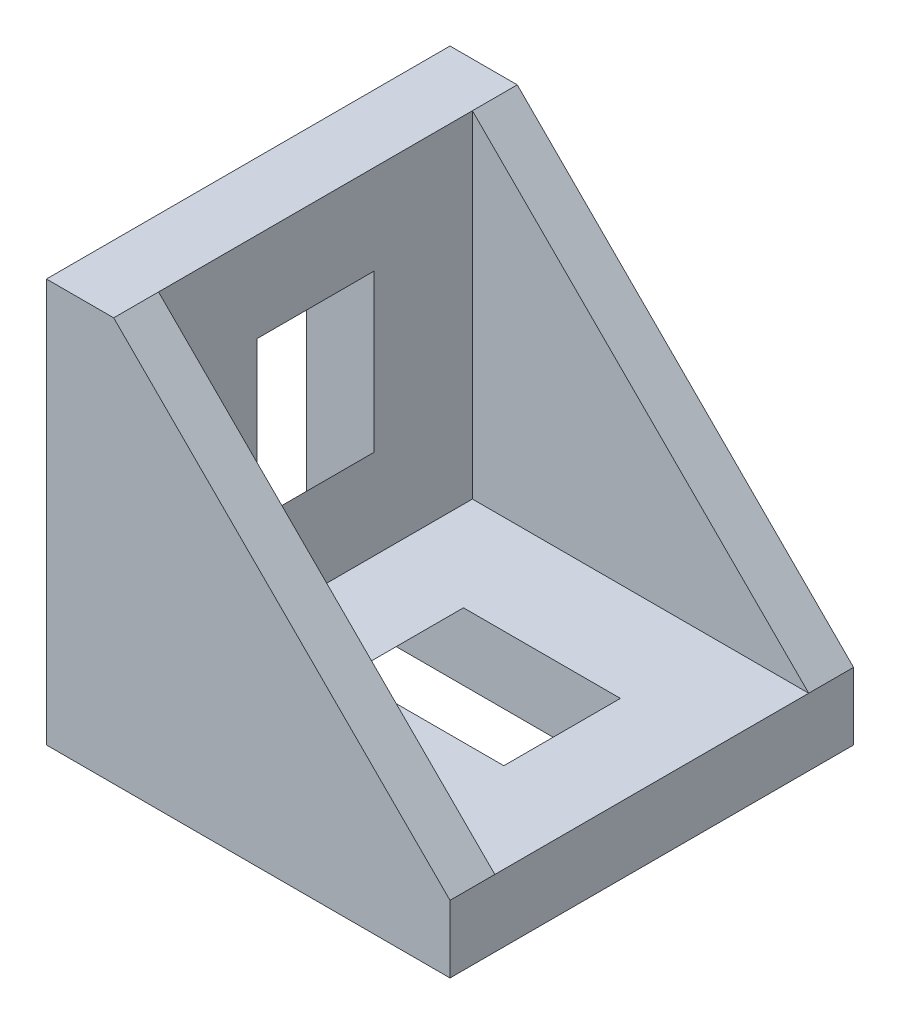
ISO-10303-21;
HEADER;
FILE_DESCRIPTION(('STEP AP214'),'2;1');
FILE_NAME('part.step','',(''),(''),'','','');
FILE_SCHEMA(('AUTOMOTIVE_DESIGN { 1 0 10303 214 1 1 1 1 }'));
ENDSEC;
DATA;
#1=APPLICATION_CONTEXT('core data for automotive mechanical design processes');
#2=APPLICATION_PROTOCOL_DEFINITION('international standard','automotive_design',2000,#1);
#3=PRODUCT_CONTEXT('',#1,'mechanical');
#4=PRODUCT('Part','Part','',(#3));
#5=PRODUCT_RELATED_PRODUCT_CATEGORY('part','',(#4));
#6=PRODUCT_DEFINITION_FORMATION('','',#4);
#7=PRODUCT_DEFINITION_CONTEXT('part definition',#1,'design');
#8=PRODUCT_DEFINITION('design','',#6,#7);
#9=PRODUCT_DEFINITION_SHAPE('','',#8);
#10=(LENGTH_UNIT() NAMED_UNIT(*) SI_UNIT(.MILLI.,.METRE.));
#11=(NAMED_UNIT(*) PLANE_ANGLE_UNIT() SI_UNIT($,.RADIAN.));
#12=(NAMED_UNIT(*) SI_UNIT($,.STERADIAN.) SOLID_ANGLE_UNIT());
#13=UNCERTAINTY_MEASURE_WITH_UNIT(LENGTH_MEASURE(1.E-05),#10,'distance_accuracy_value','');
#14=(GEOMETRIC_REPRESENTATION_CONTEXT(3) GLOBAL_UNCERTAINTY_ASSIGNED_CONTEXT((#13)) GLOBAL_UNIT_ASSIGNED_CONTEXT((#10,
#11,#12)) REPRESENTATION_CONTEXT('',''));
#15=CARTESIAN_POINT('',(0.,0.,0.));
#16=DIRECTION('',(0.,0.,1.));
#17=DIRECTION('',(1.,0.,0.));
#18=AXIS2_PLACEMENT_3D('',#15,#16,#17);
#19=CARTESIAN_POINT('',(0.,0.,9.));
#20=DIRECTION('',(1.,0.,0.));
#21=DIRECTION('',(0.,0.,-1.));
#22=AXIS2_PLACEMENT_3D('',#19,#20,#21);
#23=PLANE('',#22);
#24=DIRECTION('',(0.,0.,-1.));
#25=VECTOR('',#24,1.);
#26=CARTESIAN_POINT('',(0.,17.3,3.));
#27=LINE('',#26,#25);
#28=CARTESIAN_POINT('',(0.,17.3,3.));
#29=VERTEX_POINT('',#28);
#30=CARTESIAN_POINT('',(0.,17.3,-3.));
#31=VERTEX_POINT('',#30);
#32=EDGE_CURVE('E288',#29,#31,#27,.T.);
#33=ORIENTED_EDGE('',*,*,#32,.F.);
#34=DIRECTION('',(0.,1.,0.));
#35=VECTOR('',#34,1.);
#36=CARTESIAN_POINT('',(0.,17.3,3.));
#37=LINE('',#36,#35);
#38=CARTESIAN_POINT('',(0.,14.9992165715514,3.));
#39=VERTEX_POINT('',#38);
#40=EDGE_CURVE('E285',#39,#29,#37,.T.);
#41=ORIENTED_EDGE('',*,*,#40,.F.);
#42=DIRECTION('',(0.,0.,-1.));
#43=VECTOR('',#42,1.);
#44=CARTESIAN_POINT('',(0.,14.9992165715514,3.));
#45=LINE('',#44,#43);
#46=CARTESIAN_POINT('',(0.,14.9992165715514,-3.));
#47=VERTEX_POINT('',#46);
#48=EDGE_CURVE('E299',#39,#47,#45,.T.);
#49=ORIENTED_EDGE('',*,*,#48,.T.);
#50=DIRECTION('',(0.,1.,0.));
#51=VECTOR('',#50,1.);
#52=CARTESIAN_POINT('',(0.,17.3,-3.));
#53=LINE('',#52,#51);
#54=EDGE_CURVE('E280',#47,#31,#53,.T.);
#55=ORIENTED_EDGE('',*,*,#54,.T.);
#56=EDGE_LOOP('',(#33,#41,#49,#55));
#57=FACE_BOUND('',#56,.T.);
#58=DIRECTION('',(0.,-1.,0.));
#59=VECTOR('',#58,1.);
#60=CARTESIAN_POINT('',(0.,14.,-2.6));
#61=LINE('',#60,#59);
#62=CARTESIAN_POINT('',(0.,14.,-2.6));
#63=VERTEX_POINT('',#62);
#64=CARTESIAN_POINT('',(0.,4.,-2.6));
#65=VERTEX_POINT('',#64);
#66=EDGE_CURVE('E402',#63,#65,#61,.T.);
#67=ORIENTED_EDGE('',*,*,#66,.F.);
#68=DIRECTION('',(0.,0.,1.));
#69=VECTOR('',#68,1.);
#70=CARTESIAN_POINT('',(0.,14.,-2.6));
#71=LINE('',#70,#69);
#72=CARTESIAN_POINT('',(0.,14.,2.6));
#73=VERTEX_POINT('',#72);
#74=EDGE_CURVE('E425',#63,#73,#71,.T.);
#75=ORIENTED_EDGE('',*,*,#74,.T.);
#76=DIRECTION('',(0.,-1.,0.));
#77=VECTOR('',#76,1.);
#78=CARTESIAN_POINT('',(0.,14.,2.6));
#79=LINE('',#78,#77);
#80=CARTESIAN_POINT('',(0.,4.,2.6));
#81=VERTEX_POINT('',#80);
#82=EDGE_CURVE('E393',#73,#81,#79,.T.);
#83=ORIENTED_EDGE('',*,*,#82,.T.);
#84=DIRECTION('',(0.,0.,1.));
#85=VECTOR('',#84,1.);
#86=CARTESIAN_POINT('',(0.,4.,-2.6));
#87=LINE('',#86,#85);
#88=EDGE_CURVE('E414',#65,#81,#87,.T.);
#89=ORIENTED_EDGE('',*,*,#88,.F.);
#90=EDGE_LOOP('',(#67,#75,#83,#89));
#91=FACE_BOUND('',#90,.T.);
#92=DIRECTION('',(0.,-1.,0.));
#93=VECTOR('',#92,1.);
#94=CARTESIAN_POINT('',(0.,0.,-9.));
#95=LINE('',#94,#93);
#96=CARTESIAN_POINT('',(0.,18.,-9.));
#97=VERTEX_POINT('',#96);
#98=CARTESIAN_POINT('',(0.,0.,-9.));
#99=VERTEX_POINT('',#98);
#100=EDGE_CURVE('E465',#97,#99,#95,.T.);
#101=ORIENTED_EDGE('',*,*,#100,.T.);
#102=DIRECTION('',(0.,0.,-1.));
#103=VECTOR('',#102,1.);
#104=CARTESIAN_POINT('',(0.,0.,9.));
#105=LINE('',#104,#103);
#106=CARTESIAN_POINT('',(0.,0.,9.));
#107=VERTEX_POINT('',#106);
#108=EDGE_CURVE('E473',#107,#99,#105,.T.);
#109=ORIENTED_EDGE('',*,*,#108,.F.);
#110=DIRECTION('',(0.,-1.,0.));
#111=VECTOR('',#110,1.);
#112=CARTESIAN_POINT('',(0.,0.,9.));
#113=LINE('',#112,#111);
#114=CARTESIAN_POINT('',(0.,18.,9.));
#115=VERTEX_POINT('',#114);
#116=EDGE_CURVE('E471',#115,#107,#113,.T.);
#117=ORIENTED_EDGE('',*,*,#116,.F.);
#118=DIRECTION('',(0.,0.,-1.));
#119=VECTOR('',#118,1.);
#120=CARTESIAN_POINT('',(0.,18.,9.));
#121=LINE('',#120,#119);
#122=EDGE_CURVE('E487',#115,#97,#121,.T.);
#123=ORIENTED_EDGE('',*,*,#122,.T.);
#124=EDGE_LOOP('',(#101,#109,#117,#123));
#125=FACE_BOUND('',#124,.T.);
#126=DIRECTION('',(0.,1.,0.));
#127=VECTOR('',#126,1.);
#128=CARTESIAN_POINT('',(0.,1.23475047748417,3.));
#129=LINE('',#128,#127);
#130=CARTESIAN_POINT('',(0.,1.23475047748417,3.));
#131=VERTEX_POINT('',#130);
#132=CARTESIAN_POINT('',(0.,3.53553390593273,3.));
#133=VERTEX_POINT('',#132);
#134=EDGE_CURVE('E308',#131,#133,#129,.T.);
#135=ORIENTED_EDGE('',*,*,#134,.F.);
#136=DIRECTION('',(0.,0.,-1.));
#137=VECTOR('',#136,1.);
#138=CARTESIAN_POINT('',(0.,1.23475047748417,3.));
#139=LINE('',#138,#137);
#140=CARTESIAN_POINT('',(0.,1.23475047748417,-3.));
#141=VERTEX_POINT('',#140);
#142=EDGE_CURVE('E318',#131,#141,#139,.T.);
#143=ORIENTED_EDGE('',*,*,#142,.T.);
#144=DIRECTION('',(0.,1.,0.));
#145=VECTOR('',#144,1.);
#146=CARTESIAN_POINT('',(0.,1.23475047748417,-3.));
#147=LINE('',#146,#145);
#148=CARTESIAN_POINT('',(0.,3.53553390593273,-3.));
#149=VERTEX_POINT('',#148);
#150=EDGE_CURVE('E307',#141,#149,#147,.T.);
#151=ORIENTED_EDGE('',*,*,#150,.T.);
#152=DIRECTION('',(0.,0.,-1.));
#153=VECTOR('',#152,1.);
#154=CARTESIAN_POINT('',(0.,3.53553390593273,3.));
#155=LINE('',#154,#153);
#156=EDGE_CURVE('E334',#133,#149,#155,.T.);
#157=ORIENTED_EDGE('',*,*,#156,.F.);
#158=EDGE_LOOP('',(#135,#143,#151,#157));
#159=FACE_BOUND('',#158,.T.);
#160=ADVANCED_FACE('F32',(#57,#91,#125,#159),#23,.F.);
#161=CARTESIAN_POINT('',(18.,0.,9.));
#162=DIRECTION('',(0.,1.,0.));
#163=DIRECTION('',(-1.,0.,0.));
#164=AXIS2_PLACEMENT_3D('',#161,#162,#163);
#165=PLANE('',#164);
#166=DIRECTION('',(0.,0.,-1.));
#167=VECTOR('',#166,1.);
#168=CARTESIAN_POINT('',(14.9992165715514,0.,3.));
#169=LINE('',#168,#167);
#170=CARTESIAN_POINT('',(14.9992165715514,0.,3.));
#171=VERTEX_POINT('',#170);
#172=CARTESIAN_POINT('',(14.9992165715514,0.,-3.));
#173=VERTEX_POINT('',#172);
#174=EDGE_CURVE('E47',#171,#173,#169,.T.);
#175=ORIENTED_EDGE('',*,*,#174,.F.);
#176=DIRECTION('',(-1.,0.,0.));
#177=VECTOR('',#176,1.);
#178=CARTESIAN_POINT('',(17.3,0.,3.));
#179=LINE('',#178,#177);
#180=CARTESIAN_POINT('',(17.3,0.,3.));
#181=VERTEX_POINT('',#180);
#182=EDGE_CURVE('E52',#181,#171,#179,.T.);
#183=ORIENTED_EDGE('',*,*,#182,.F.);
#184=DIRECTION('',(0.,0.,-1.));
#185=VECTOR('',#184,1.);
#186=CARTESIAN_POINT('',(17.3,0.,3.));
#187=LINE('',#186,#185);
#188=CARTESIAN_POINT('',(17.3,0.,-3.));
#189=VERTEX_POINT('',#188);
#190=EDGE_CURVE('E260',#181,#189,#187,.T.);
#191=ORIENTED_EDGE('',*,*,#190,.T.);
#192=DIRECTION('',(-1.,0.,0.));
#193=VECTOR('',#192,1.);
#194=CARTESIAN_POINT('',(17.3,0.,-3.));
#195=LINE('',#194,#193);
#196=EDGE_CURVE('E264',#189,#173,#195,.T.);
#197=ORIENTED_EDGE('',*,*,#196,.T.);
#198=EDGE_LOOP('',(#175,#183,#191,#197));
#199=FACE_BOUND('',#198,.T.);
#200=DIRECTION('',(1.,0.,0.));
#201=VECTOR('',#200,1.);
#202=CARTESIAN_POINT('',(4.,0.,-2.6));
#203=LINE('',#202,#201);
#204=CARTESIAN_POINT('',(4.,0.,-2.6));
#205=VERTEX_POINT('',#204);
#206=CARTESIAN_POINT('',(14.,0.,-2.6));
#207=VERTEX_POINT('',#206);
#208=EDGE_CURVE('E370',#205,#207,#203,.T.);
#209=ORIENTED_EDGE('',*,*,#208,.F.);
#210=DIRECTION('',(0.,0.,1.));
#211=VECTOR('',#210,1.);
#212=CARTESIAN_POINT('',(4.,0.,-2.6));
#213=LINE('',#212,#211);
#214=CARTESIAN_POINT('',(4.,0.,2.6));
#215=VERTEX_POINT('',#214);
#216=EDGE_CURVE('E380',#205,#215,#213,.T.);
#217=ORIENTED_EDGE('',*,*,#216,.T.);
#218=DIRECTION('',(1.,0.,0.));
#219=VECTOR('',#218,1.);
#220=CARTESIAN_POINT('',(4.,0.,2.6));
#221=LINE('',#220,#219);
#222=CARTESIAN_POINT('',(14.,0.,2.6));
#223=VERTEX_POINT('',#222);
#224=EDGE_CURVE('E383',#215,#223,#221,.T.);
#225=ORIENTED_EDGE('',*,*,#224,.T.);
#226=DIRECTION('',(0.,0.,1.));
#227=VECTOR('',#226,1.);
#228=CARTESIAN_POINT('',(14.,0.,-2.6));
#229=LINE('',#228,#227);
#230=EDGE_CURVE('E397',#207,#223,#229,.T.);
#231=ORIENTED_EDGE('',*,*,#230,.F.);
#232=EDGE_LOOP('',(#209,#217,#225,#231));
#233=FACE_BOUND('',#232,.T.);
#234=DIRECTION('',(1.,0.,0.));
#235=VECTOR('',#234,1.);
#236=CARTESIAN_POINT('',(18.,0.,-9.));
#237=LINE('',#236,#235);
#238=CARTESIAN_POINT('',(18.,0.,-9.));
#239=VERTEX_POINT('',#238);
#240=EDGE_CURVE('E457',#99,#239,#237,.T.);
#241=ORIENTED_EDGE('',*,*,#240,.T.);
#242=DIRECTION('',(0.,0.,-1.));
#243=VECTOR('',#242,1.);
#244=CARTESIAN_POINT('',(18.,0.,9.));
#245=LINE('',#244,#243);
#246=CARTESIAN_POINT('',(18.,0.,9.));
#247=VERTEX_POINT('',#246);
#248=EDGE_CURVE('E11',#247,#239,#245,.T.);
#249=ORIENTED_EDGE('',*,*,#248,.F.);
#250=DIRECTION('',(1.,0.,0.));
#251=VECTOR('',#250,1.);
#252=CARTESIAN_POINT('',(18.,0.,9.));
#253=LINE('',#252,#251);
#254=EDGE_CURVE('E461',#107,#247,#253,.T.);
#255=ORIENTED_EDGE('',*,*,#254,.F.);
#256=ORIENTED_EDGE('',*,*,#108,.T.);
#257=EDGE_LOOP('',(#241,#249,#255,#256));
#258=FACE_BOUND('',#257,.T.);
#259=DIRECTION('',(-1.,0.,0.));
#260=VECTOR('',#259,1.);
#261=CARTESIAN_POINT('',(1.23475047748409,0.,3.));
#262=LINE('',#261,#260);
#263=CARTESIAN_POINT('',(3.53553390593274,0.,3.));
#264=VERTEX_POINT('',#263);
#265=CARTESIAN_POINT('',(1.23475047748409,0.,3.));
#266=VERTEX_POINT('',#265);
#267=EDGE_CURVE('E339',#264,#266,#262,.T.);
#268=ORIENTED_EDGE('',*,*,#267,.F.);
#269=DIRECTION('',(0.,0.,-1.));
#270=VECTOR('',#269,1.);
#271=CARTESIAN_POINT('',(3.53553390593274,0.,3.));
#272=LINE('',#271,#270);
#273=CARTESIAN_POINT('',(3.53553390593274,0.,-3.));
#274=VERTEX_POINT('',#273);
#275=EDGE_CURVE('E363',#264,#274,#272,.T.);
#276=ORIENTED_EDGE('',*,*,#275,.T.);
#277=DIRECTION('',(-1.,0.,0.));
#278=VECTOR('',#277,1.);
#279=CARTESIAN_POINT('',(1.23475047748409,0.,-3.));
#280=LINE('',#279,#278);
#281=CARTESIAN_POINT('',(1.23475047748409,0.,-3.));
#282=VERTEX_POINT('',#281);
#283=EDGE_CURVE('E349',#274,#282,#280,.T.);
#284=ORIENTED_EDGE('',*,*,#283,.T.);
#285=DIRECTION('',(0.,0.,-1.));
#286=VECTOR('',#285,1.);
#287=CARTESIAN_POINT('',(1.23475047748409,0.,3.));
#288=LINE('',#287,#286);
#289=EDGE_CURVE('E360',#266,#282,#288,.T.);
#290=ORIENTED_EDGE('',*,*,#289,.F.);
#291=EDGE_LOOP('',(#268,#276,#284,#290));
#292=FACE_BOUND('',#291,.T.);
#293=ADVANCED_FACE('F34',(#199,#233,#258,#292),#165,.F.);
#294=CARTESIAN_POINT('',(3.,3.,-7.));
#295=DIRECTION('',(0.,-1.,0.));
#296=DIRECTION('',(0.,0.,-1.));
#297=AXIS2_PLACEMENT_3D('',#294,#295,#296);
#298=PLANE('',#297);
#299=DIRECTION('',(1.,0.,0.));
#300=VECTOR('',#299,1.);
#301=CARTESIAN_POINT('',(3.,3.,7.));
#302=LINE('',#301,#300);
#303=CARTESIAN_POINT('',(3.,3.,7.));
#304=VERTEX_POINT('',#303);
#305=CARTESIAN_POINT('',(18.,3.,7.));
#306=VERTEX_POINT('',#305);
#307=EDGE_CURVE('E440',#304,#306,#302,.T.);
#308=ORIENTED_EDGE('',*,*,#307,.T.);
#309=DIRECTION('',(0.,0.,1.));
#310=VECTOR('',#309,1.);
#311=CARTESIAN_POINT('',(18.,3.,-7.));
#312=LINE('',#311,#310);
#313=CARTESIAN_POINT('',(18.,3.,-7.));
#314=VERTEX_POINT('',#313);
#315=EDGE_CURVE('E454',#314,#306,#312,.T.);
#316=ORIENTED_EDGE('',*,*,#315,.F.);
#317=DIRECTION('',(1.,0.,0.));
#318=VECTOR('',#317,1.);
#319=CARTESIAN_POINT('',(3.,3.,-7.));
#320=LINE('',#319,#318);
#321=CARTESIAN_POINT('',(3.,3.,-7.));
#322=VERTEX_POINT('',#321);
#323=EDGE_CURVE('E443',#322,#314,#320,.T.);
#324=ORIENTED_EDGE('',*,*,#323,.F.);
#325=DIRECTION('',(0.,0.,1.));
#326=VECTOR('',#325,1.);
#327=CARTESIAN_POINT('',(3.,3.,-7.));
#328=LINE('',#327,#326);
#329=EDGE_CURVE('E458',#322,#304,#328,.T.);
#330=ORIENTED_EDGE('',*,*,#329,.T.);
#331=EDGE_LOOP('',(#308,#316,#324,#330));
#332=FACE_BOUND('',#331,.T.);
#333=DIRECTION('',(-1.,0.,0.));
#334=VECTOR('',#333,1.);
#335=CARTESIAN_POINT('',(7.,3.,-2.6));
#336=LINE('',#335,#334);
#337=CARTESIAN_POINT('',(14.,3.,-2.6));
#338=VERTEX_POINT('',#337);
#339=CARTESIAN_POINT('',(7.,3.,-2.6));
#340=VERTEX_POINT('',#339);
#341=EDGE_CURVE('E377',#338,#340,#336,.T.);
#342=ORIENTED_EDGE('',*,*,#341,.F.);
#343=DIRECTION('',(0.,0.,1.));
#344=VECTOR('',#343,1.);
#345=CARTESIAN_POINT('',(14.,3.,-2.6));
#346=LINE('',#345,#344);
#347=CARTESIAN_POINT('',(14.,3.,2.6));
#348=VERTEX_POINT('',#347);
#349=EDGE_CURVE('E394',#338,#348,#346,.T.);
#350=ORIENTED_EDGE('',*,*,#349,.T.);
#351=DIRECTION('',(-1.,0.,0.));
#352=VECTOR('',#351,1.);
#353=CARTESIAN_POINT('',(7.,3.,2.6));
#354=LINE('',#353,#352);
#355=CARTESIAN_POINT('',(7.,3.,2.6));
#356=VERTEX_POINT('',#355);
#357=EDGE_CURVE('E371',#348,#356,#354,.T.);
#358=ORIENTED_EDGE('',*,*,#357,.T.);
#359=DIRECTION('',(0.,0.,1.));
#360=VECTOR('',#359,1.);
#361=CARTESIAN_POINT('',(7.,3.,-2.6));
#362=LINE('',#361,#360);
#363=EDGE_CURVE('E390',#340,#356,#362,.T.);
#364=ORIENTED_EDGE('',*,*,#363,.F.);
#365=EDGE_LOOP('',(#342,#350,#358,#364));
#366=FACE_BOUND('',#365,.T.);
#367=ADVANCED_FACE('F531',(#332,#366),#298,.F.);
#368=CARTESIAN_POINT('',(3.,18.,-7.));
#369=DIRECTION('',(-1.,0.,0.));
#370=DIRECTION('',(0.,-1.,0.));
#371=AXIS2_PLACEMENT_3D('',#368,#369,#370);
#372=PLANE('',#371);
#373=DIRECTION('',(0.,-1.,0.));
#374=VECTOR('',#373,1.);
#375=CARTESIAN_POINT('',(3.,18.,7.));
#376=LINE('',#375,#374);
#377=CARTESIAN_POINT('',(3.,18.,7.));
#378=VERTEX_POINT('',#377);
#379=EDGE_CURVE('E449',#378,#304,#376,.T.);
#380=ORIENTED_EDGE('',*,*,#379,.T.);
#381=ORIENTED_EDGE('',*,*,#329,.F.);
#382=DIRECTION('',(0.,-1.,0.));
#383=VECTOR('',#382,1.);
#384=CARTESIAN_POINT('',(3.,18.,-7.));
#385=LINE('',#384,#383);
#386=CARTESIAN_POINT('',(3.,18.,-7.));
#387=VERTEX_POINT('',#386);
#388=EDGE_CURVE('E439',#387,#322,#385,.T.);
#389=ORIENTED_EDGE('',*,*,#388,.F.);
#390=DIRECTION('',(0.,0.,1.));
#391=VECTOR('',#390,1.);
#392=CARTESIAN_POINT('',(3.,18.,-7.));
#393=LINE('',#392,#391);
#394=EDGE_CURVE('E446',#387,#378,#393,.T.);
#395=ORIENTED_EDGE('',*,*,#394,.T.);
#396=EDGE_LOOP('',(#380,#381,#389,#395));
#397=FACE_BOUND('',#396,.T.);
#398=DIRECTION('',(0.,1.,0.));
#399=VECTOR('',#398,1.);
#400=CARTESIAN_POINT('',(3.,14.,-2.6));
#401=LINE('',#400,#399);
#402=CARTESIAN_POINT('',(3.,7.,-2.6));
#403=VERTEX_POINT('',#402);
#404=CARTESIAN_POINT('',(3.,14.,-2.6));
#405=VERTEX_POINT('',#404);
#406=EDGE_CURVE('E409',#403,#405,#401,.T.);
#407=ORIENTED_EDGE('',*,*,#406,.F.);
#408=DIRECTION('',(0.,0.,1.));
#409=VECTOR('',#408,1.);
#410=CARTESIAN_POINT('',(3.,7.,-2.6));
#411=LINE('',#410,#409);
#412=CARTESIAN_POINT('',(3.,7.,2.6));
#413=VERTEX_POINT('',#412);
#414=EDGE_CURVE('E432',#403,#413,#411,.T.);
#415=ORIENTED_EDGE('',*,*,#414,.T.);
#416=DIRECTION('',(0.,1.,0.));
#417=VECTOR('',#416,1.);
#418=CARTESIAN_POINT('',(3.,14.,2.6));
#419=LINE('',#418,#417);
#420=CARTESIAN_POINT('',(3.,14.,2.6));
#421=VERTEX_POINT('',#420);
#422=EDGE_CURVE('E420',#413,#421,#419,.T.);
#423=ORIENTED_EDGE('',*,*,#422,.T.);
#424=DIRECTION('',(0.,0.,1.));
#425=VECTOR('',#424,1.);
#426=CARTESIAN_POINT('',(3.,14.,-2.6));
#427=LINE('',#426,#425);
#428=EDGE_CURVE('E429',#405,#421,#427,.T.);
#429=ORIENTED_EDGE('',*,*,#428,.F.);
#430=EDGE_LOOP('',(#407,#415,#423,#429));
#431=FACE_BOUND('',#430,.T.);
#432=ADVANCED_FACE('F536',(#397,#431),#372,.F.);
#433=CARTESIAN_POINT('',(18.,3.,9.));
#434=DIRECTION('',(-0.707106781186547,-0.707106781186547,0.));
#435=DIRECTION('',(0.707106781186548,-0.707106781186548,0.));
#436=AXIS2_PLACEMENT_3D('',#433,#434,#435);
#437=PLANE('',#436);
#438=DIRECTION('',(-0.707106781186547,0.707106781186547,0.));
#439=VECTOR('',#438,1.);
#440=CARTESIAN_POINT('',(3.,18.,-7.));
#441=LINE('',#440,#439);
#442=EDGE_CURVE('E437',#314,#387,#441,.T.);
#443=ORIENTED_EDGE('',*,*,#442,.F.);
#444=DIRECTION('',(0.,0.,-1.));
#445=VECTOR('',#444,1.);
#446=CARTESIAN_POINT('',(18.,3.,9.));
#447=LINE('',#446,#445);
#448=CARTESIAN_POINT('',(18.,3.,-9.));
#449=VERTEX_POINT('',#448);
#450=EDGE_CURVE('E493',#314,#449,#447,.T.);
#451=ORIENTED_EDGE('',*,*,#450,.T.);
#452=DIRECTION('',(-0.707106781186547,0.707106781186547,0.));
#453=VECTOR('',#452,1.);
#454=CARTESIAN_POINT('',(18.,3.,-9.));
#455=LINE('',#454,#453);
#456=CARTESIAN_POINT('',(3.,18.,-9.));
#457=VERTEX_POINT('',#456);
#458=EDGE_CURVE('E479',#449,#457,#455,.T.);
#459=ORIENTED_EDGE('',*,*,#458,.T.);
#460=DIRECTION('',(0.,0.,-1.));
#461=VECTOR('',#460,1.);
#462=CARTESIAN_POINT('',(3.,18.,9.));
#463=LINE('',#462,#461);
#464=EDGE_CURVE('E490',#387,#457,#463,.T.);
#465=ORIENTED_EDGE('',*,*,#464,.F.);
#466=EDGE_LOOP('',(#443,#451,#459,#465));
#467=FACE_BOUND('',#466,.T.);
#468=ADVANCED_FACE('F501',(#467),#437,.F.);
#469=CARTESIAN_POINT('',(18.,3.,9.));
#470=DIRECTION('',(-1.,0.,0.));
#471=DIRECTION('',(0.,0.,1.));
#472=AXIS2_PLACEMENT_3D('',#469,#470,#471);
#473=PLANE('',#472);
#474=DIRECTION('',(0.,1.,0.));
#475=VECTOR('',#474,1.);
#476=CARTESIAN_POINT('',(18.,3.,-9.));
#477=LINE('',#476,#475);
#478=EDGE_CURVE('E476',#239,#449,#477,.T.);
#479=ORIENTED_EDGE('',*,*,#478,.T.);
#480=ORIENTED_EDGE('',*,*,#450,.F.);
#481=ORIENTED_EDGE('',*,*,#315,.T.);
#482=CARTESIAN_POINT('',(18.,3.,9.));
#483=VERTEX_POINT('',#482);
#484=EDGE_CURVE('E40',#483,#306,#447,.T.);
#485=ORIENTED_EDGE('',*,*,#484,.F.);
#486=DIRECTION('',(0.,1.,0.));
#487=VECTOR('',#486,1.);
#488=CARTESIAN_POINT('',(18.,3.,9.));
#489=LINE('',#488,#487);
#490=EDGE_CURVE('E464',#247,#483,#489,.T.);
#491=ORIENTED_EDGE('',*,*,#490,.F.);
#492=ORIENTED_EDGE('',*,*,#248,.T.);
#493=EDGE_LOOP('',(#479,#480,#481,#485,#491,#492));
#494=FACE_BOUND('',#493,.T.);
#495=ADVANCED_FACE('F506',(#494),#473,.F.);
#496=ORIENTED_EDGE('',*,*,#484,.T.);
#497=DIRECTION('',(-0.707106781186547,0.707106781186547,0.));
#498=VECTOR('',#497,1.);
#499=CARTESIAN_POINT('',(3.,18.,7.));
#500=LINE('',#499,#498);
#501=EDGE_CURVE('E428',#306,#378,#500,.T.);
#502=ORIENTED_EDGE('',*,*,#501,.T.);
#503=CARTESIAN_POINT('',(3.,18.,9.));
#504=VERTEX_POINT('',#503);
#505=EDGE_CURVE('E491',#504,#378,#463,.T.);
#506=ORIENTED_EDGE('',*,*,#505,.F.);
#507=DIRECTION('',(-0.707106781186547,0.707106781186547,0.));
#508=VECTOR('',#507,1.);
#509=CARTESIAN_POINT('',(18.,3.,9.));
#510=LINE('',#509,#508);
#511=EDGE_CURVE('E467',#483,#504,#510,.T.);
#512=ORIENTED_EDGE('',*,*,#511,.F.);
#513=EDGE_LOOP('',(#496,#502,#506,#512));
#514=FACE_BOUND('',#513,.T.);
#515=ADVANCED_FACE('F525',(#514),#437,.F.);
#516=CARTESIAN_POINT('',(3.,18.,9.));
#517=DIRECTION('',(0.,-1.,0.));
#518=DIRECTION('',(0.,0.,-1.));
#519=AXIS2_PLACEMENT_3D('',#516,#517,#518);
#520=PLANE('',#519);
#521=DIRECTION('',(-1.,0.,0.));
#522=VECTOR('',#521,1.);
#523=CARTESIAN_POINT('',(3.,18.,-9.));
#524=LINE('',#523,#522);
#525=EDGE_CURVE('E482',#457,#97,#524,.T.);
#526=ORIENTED_EDGE('',*,*,#525,.T.);
#527=ORIENTED_EDGE('',*,*,#122,.F.);
#528=DIRECTION('',(-1.,0.,0.));
#529=VECTOR('',#528,1.);
#530=CARTESIAN_POINT('',(3.,18.,9.));
#531=LINE('',#530,#529);
#532=EDGE_CURVE('E469',#504,#115,#531,.T.);
#533=ORIENTED_EDGE('',*,*,#532,.F.);
#534=ORIENTED_EDGE('',*,*,#505,.T.);
#535=ORIENTED_EDGE('',*,*,#394,.F.);
#536=ORIENTED_EDGE('',*,*,#464,.T.);
#537=EDGE_LOOP('',(#526,#527,#533,#534,#535,#536));
#538=FACE_BOUND('',#537,.T.);
#539=ADVANCED_FACE('F514',(#538),#520,.F.);
#540=CARTESIAN_POINT('',(0.,0.,9.));
#541=DIRECTION('',(0.,0.,-1.));
#542=DIRECTION('',(-1.,0.,0.));
#543=AXIS2_PLACEMENT_3D('',#540,#541,#542);
#544=PLANE('',#543);
#545=ORIENTED_EDGE('',*,*,#254,.T.);
#546=ORIENTED_EDGE('',*,*,#490,.T.);
#547=ORIENTED_EDGE('',*,*,#511,.T.);
#548=ORIENTED_EDGE('',*,*,#532,.T.);
#549=ORIENTED_EDGE('',*,*,#116,.T.);
#550=EDGE_LOOP('',(#545,#546,#547,#548,#549));
#551=FACE_BOUND('',#550,.T.);
#552=ADVANCED_FACE('F523',(#551),#544,.F.);
#553=CARTESIAN_POINT('',(0.,0.,-9.));
#554=DIRECTION('',(0.,0.,-1.));
#555=DIRECTION('',(-1.,0.,0.));
#556=AXIS2_PLACEMENT_3D('',#553,#554,#555);
#557=PLANE('',#556);
#558=ORIENTED_EDGE('',*,*,#240,.F.);
#559=ORIENTED_EDGE('',*,*,#100,.F.);
#560=ORIENTED_EDGE('',*,*,#525,.F.);
#561=ORIENTED_EDGE('',*,*,#458,.F.);
#562=ORIENTED_EDGE('',*,*,#478,.F.);
#563=EDGE_LOOP('',(#558,#559,#560,#561,#562));
#564=FACE_BOUND('',#563,.T.);
#565=ADVANCED_FACE('F510',(#564),#557,.T.);
#566=CARTESIAN_POINT('',(18.,3.,-7.));
#567=DIRECTION('',(0.,0.,1.));
#568=DIRECTION('',(1.,0.,0.));
#569=AXIS2_PLACEMENT_3D('',#566,#567,#568);
#570=PLANE('',#569);
#571=ORIENTED_EDGE('',*,*,#442,.T.);
#572=ORIENTED_EDGE('',*,*,#388,.T.);
#573=ORIENTED_EDGE('',*,*,#323,.T.);
#574=EDGE_LOOP('',(#571,#572,#573));
#575=FACE_BOUND('',#574,.T.);
#576=ADVANCED_FACE('F539',(#575),#570,.T.);
#577=CARTESIAN_POINT('',(18.,3.,7.));
#578=DIRECTION('',(0.,0.,1.));
#579=DIRECTION('',(1.,0.,0.));
#580=AXIS2_PLACEMENT_3D('',#577,#578,#579);
#581=PLANE('',#580);
#582=ORIENTED_EDGE('',*,*,#501,.F.);
#583=ORIENTED_EDGE('',*,*,#307,.F.);
#584=ORIENTED_EDGE('',*,*,#379,.F.);
#585=EDGE_LOOP('',(#582,#583,#584));
#586=FACE_BOUND('',#585,.T.);
#587=ADVANCED_FACE('F529',(#586),#581,.F.);
#588=CARTESIAN_POINT('',(0.,14.,-2.6));
#589=DIRECTION('',(0.,1.,0.));
#590=DIRECTION('',(0.,0.,1.));
#591=AXIS2_PLACEMENT_3D('',#588,#589,#590);
#592=PLANE('',#591);
#593=DIRECTION('',(-1.,0.,0.));
#594=VECTOR('',#593,1.);
#595=CARTESIAN_POINT('',(0.,14.,2.6));
#596=LINE('',#595,#594);
#597=EDGE_CURVE('E406',#421,#73,#596,.T.);
#598=ORIENTED_EDGE('',*,*,#597,.T.);
#599=ORIENTED_EDGE('',*,*,#74,.F.);
#600=DIRECTION('',(-1.,0.,0.));
#601=VECTOR('',#600,1.);
#602=CARTESIAN_POINT('',(0.,14.,-2.6));
#603=LINE('',#602,#601);
#604=EDGE_CURVE('E411',#405,#63,#603,.T.);
#605=ORIENTED_EDGE('',*,*,#604,.F.);
#606=ORIENTED_EDGE('',*,*,#428,.T.);
#607=EDGE_LOOP('',(#598,#599,#605,#606));
#608=FACE_BOUND('',#607,.T.);
#609=ADVANCED_FACE('F546',(#608),#592,.F.);
#610=CARTESIAN_POINT('',(0.,4.,-2.6));
#611=DIRECTION('',(0.707106781186548,-0.707106781186547,0.));
#612=DIRECTION('',(0.707106781186547,0.707106781186548,0.));
#613=AXIS2_PLACEMENT_3D('',#610,#611,#612);
#614=PLANE('',#613);
#615=DIRECTION('',(0.707106781186547,0.707106781186548,0.));
#616=VECTOR('',#615,1.);
#617=CARTESIAN_POINT('',(0.,4.,2.6));
#618=LINE('',#617,#616);
#619=EDGE_CURVE('E417',#81,#413,#618,.T.);
#620=ORIENTED_EDGE('',*,*,#619,.T.);
#621=ORIENTED_EDGE('',*,*,#414,.F.);
#622=DIRECTION('',(0.707106781186547,0.707106781186548,0.));
#623=VECTOR('',#622,1.);
#624=CARTESIAN_POINT('',(0.,4.,-2.6));
#625=LINE('',#624,#623);
#626=EDGE_CURVE('E405',#65,#403,#625,.T.);
#627=ORIENTED_EDGE('',*,*,#626,.F.);
#628=ORIENTED_EDGE('',*,*,#88,.T.);
#629=EDGE_LOOP('',(#620,#621,#627,#628));
#630=FACE_BOUND('',#629,.T.);
#631=ADVANCED_FACE('F630',(#630),#614,.F.);
#632=CARTESIAN_POINT('',(0.,14.,-2.6));
#633=DIRECTION('',(0.,0.,1.));
#634=DIRECTION('',(1.,0.,0.));
#635=AXIS2_PLACEMENT_3D('',#632,#633,#634);
#636=PLANE('',#635);
#637=ORIENTED_EDGE('',*,*,#66,.T.);
#638=ORIENTED_EDGE('',*,*,#626,.T.);
#639=ORIENTED_EDGE('',*,*,#406,.T.);
#640=ORIENTED_EDGE('',*,*,#604,.T.);
#641=EDGE_LOOP('',(#637,#638,#639,#640));
#642=FACE_BOUND('',#641,.T.);
#643=ADVANCED_FACE('F640',(#642),#636,.T.);
#644=CARTESIAN_POINT('',(0.,14.,2.6));
#645=DIRECTION('',(0.,0.,1.));
#646=DIRECTION('',(1.,0.,0.));
#647=AXIS2_PLACEMENT_3D('',#644,#645,#646);
#648=PLANE('',#647);
#649=ORIENTED_EDGE('',*,*,#82,.F.);
#650=ORIENTED_EDGE('',*,*,#597,.F.);
#651=ORIENTED_EDGE('',*,*,#422,.F.);
#652=ORIENTED_EDGE('',*,*,#619,.F.);
#653=EDGE_LOOP('',(#649,#650,#651,#652));
#654=FACE_BOUND('',#653,.T.);
#655=ADVANCED_FACE('F649',(#654),#648,.F.);
#656=CARTESIAN_POINT('',(7.,3.,-2.6));
#657=DIRECTION('',(-0.707106781186548,0.707106781186547,0.));
#658=DIRECTION('',(-0.707106781186547,-0.707106781186548,0.));
#659=AXIS2_PLACEMENT_3D('',#656,#657,#658);
#660=PLANE('',#659);
#661=DIRECTION('',(-0.707106781186547,-0.707106781186548,0.));
#662=VECTOR('',#661,1.);
#663=CARTESIAN_POINT('',(7.,3.,2.6));
#664=LINE('',#663,#662);
#665=EDGE_CURVE('E366',#356,#215,#664,.T.);
#666=ORIENTED_EDGE('',*,*,#665,.T.);
#667=ORIENTED_EDGE('',*,*,#216,.F.);
#668=DIRECTION('',(-0.707106781186547,-0.707106781186548,0.));
#669=VECTOR('',#668,1.);
#670=CARTESIAN_POINT('',(7.,3.,-2.6));
#671=LINE('',#670,#669);
#672=EDGE_CURVE('E367',#340,#205,#671,.T.);
#673=ORIENTED_EDGE('',*,*,#672,.F.);
#674=ORIENTED_EDGE('',*,*,#363,.T.);
#675=EDGE_LOOP('',(#666,#667,#673,#674));
#676=FACE_BOUND('',#675,.T.);
#677=ADVANCED_FACE('F659',(#676),#660,.F.);
#678=CARTESIAN_POINT('',(14.,3.,-2.6));
#679=DIRECTION('',(1.,0.,0.));
#680=DIRECTION('',(0.,0.,-1.));
#681=AXIS2_PLACEMENT_3D('',#678,#679,#680);
#682=PLANE('',#681);
#683=DIRECTION('',(0.,1.,0.));
#684=VECTOR('',#683,1.);
#685=CARTESIAN_POINT('',(14.,3.,2.6));
#686=LINE('',#685,#684);
#687=EDGE_CURVE('E386',#223,#348,#686,.T.);
#688=ORIENTED_EDGE('',*,*,#687,.T.);
#689=ORIENTED_EDGE('',*,*,#349,.F.);
#690=DIRECTION('',(0.,1.,0.));
#691=VECTOR('',#690,1.);
#692=CARTESIAN_POINT('',(14.,3.,-2.6));
#693=LINE('',#692,#691);
#694=EDGE_CURVE('E374',#207,#338,#693,.T.);
#695=ORIENTED_EDGE('',*,*,#694,.F.);
#696=ORIENTED_EDGE('',*,*,#230,.T.);
#697=EDGE_LOOP('',(#688,#689,#695,#696));
#698=FACE_BOUND('',#697,.T.);
#699=ADVANCED_FACE('F669',(#698),#682,.F.);
#700=CARTESIAN_POINT('',(4.,0.,-2.6));
#701=DIRECTION('',(0.,0.,1.));
#702=DIRECTION('',(1.,0.,0.));
#703=AXIS2_PLACEMENT_3D('',#700,#701,#702);
#704=PLANE('',#703);
#705=ORIENTED_EDGE('',*,*,#672,.T.);
#706=ORIENTED_EDGE('',*,*,#208,.T.);
#707=ORIENTED_EDGE('',*,*,#694,.T.);
#708=ORIENTED_EDGE('',*,*,#341,.T.);
#709=EDGE_LOOP('',(#705,#706,#707,#708));
#710=FACE_BOUND('',#709,.T.);
#711=ADVANCED_FACE('F679',(#710),#704,.T.);
#712=CARTESIAN_POINT('',(4.,0.,2.6));
#713=DIRECTION('',(0.,0.,1.));
#714=DIRECTION('',(1.,0.,0.));
#715=AXIS2_PLACEMENT_3D('',#712,#713,#714);
#716=PLANE('',#715);
#717=ORIENTED_EDGE('',*,*,#665,.F.);
#718=ORIENTED_EDGE('',*,*,#357,.F.);
#719=ORIENTED_EDGE('',*,*,#687,.F.);
#720=ORIENTED_EDGE('',*,*,#224,.F.);
#721=EDGE_LOOP('',(#717,#718,#719,#720));
#722=FACE_BOUND('',#721,.T.);
#723=ADVANCED_FACE('F689',(#722),#716,.F.);
#724=CARTESIAN_POINT('',(3.53553390593274,0.,3.));
#725=DIRECTION('',(-0.663272861612076,0.748377652692093,0.));
#726=DIRECTION('',(-0.748377652692093,-0.663272861612076,0.));
#727=AXIS2_PLACEMENT_3D('',#724,#725,#726);
#728=PLANE('',#727);
#729=DIRECTION('',(0.748377652692093,0.663272861612076,0.));
#730=VECTOR('',#729,1.);
#731=CARTESIAN_POINT('',(3.53553390593274,0.,-3.));
#732=LINE('',#731,#730);
#733=CARTESIAN_POINT('',(1.50457522691833,-1.8,-3.));
#734=VERTEX_POINT('',#733);
#735=EDGE_CURVE('E336',#734,#274,#732,.T.);
#736=ORIENTED_EDGE('',*,*,#735,.T.);
#737=ORIENTED_EDGE('',*,*,#275,.F.);
#738=DIRECTION('',(0.748377652692093,0.663272861612076,0.));
#739=VECTOR('',#738,1.);
#740=CARTESIAN_POINT('',(3.53553390593274,0.,3.));
#741=LINE('',#740,#739);
#742=CARTESIAN_POINT('',(1.50457522691833,-1.8,3.));
#743=VERTEX_POINT('',#742);
#744=EDGE_CURVE('E337',#743,#264,#741,.T.);
#745=ORIENTED_EDGE('',*,*,#744,.F.);
#746=DIRECTION('',(0.,0.,-1.));
#747=VECTOR('',#746,1.);
#748=CARTESIAN_POINT('',(1.50457522691833,-1.8,3.));
#749=LINE('',#748,#747);
#750=EDGE_CURVE('E346',#743,#734,#749,.T.);
#751=ORIENTED_EDGE('',*,*,#750,.T.);
#752=EDGE_LOOP('',(#736,#737,#745,#751));
#753=FACE_BOUND('',#752,.T.);
#754=ADVANCED_FACE('F698',(#753),#728,.F.);
#755=CARTESIAN_POINT('',(0.511249685150937,-0.790946088307917,3.));
#756=DIRECTION('',(0.737866149456581,-0.674947068655105,0.));
#757=DIRECTION('',(0.674947068655105,0.737866149456581,0.));
#758=AXIS2_PLACEMENT_3D('',#755,#756,#757);
#759=PLANE('',#758);
#760=DIRECTION('',(-0.674947068655105,-0.737866149456581,0.));
#761=VECTOR('',#760,1.);
#762=CARTESIAN_POINT('',(0.511249685150937,-0.790946088307917,-3.));
#763=LINE('',#762,#761);
#764=CARTESIAN_POINT('',(0.511249685150937,-0.790946088307917,-3.));
#765=VERTEX_POINT('',#764);
#766=EDGE_CURVE('E352',#282,#765,#763,.T.);
#767=ORIENTED_EDGE('',*,*,#766,.T.);
#768=DIRECTION('',(0.,0.,-1.));
#769=VECTOR('',#768,1.);
#770=CARTESIAN_POINT('',(0.511249685150937,-0.790946088307917,3.));
#771=LINE('',#770,#769);
#772=CARTESIAN_POINT('',(0.511249685150937,-0.790946088307917,3.));
#773=VERTEX_POINT('',#772);
#774=EDGE_CURVE('E357',#773,#765,#771,.T.);
#775=ORIENTED_EDGE('',*,*,#774,.F.);
#776=DIRECTION('',(-0.674947068655105,-0.737866149456581,0.));
#777=VECTOR('',#776,1.);
#778=CARTESIAN_POINT('',(0.511249685150937,-0.790946088307917,3.));
#779=LINE('',#778,#777);
#780=EDGE_CURVE('E342',#266,#773,#779,.T.);
#781=ORIENTED_EDGE('',*,*,#780,.F.);
#782=ORIENTED_EDGE('',*,*,#289,.T.);
#783=EDGE_LOOP('',(#767,#775,#781,#782));
#784=FACE_BOUND('',#783,.T.);
#785=ADVANCED_FACE('F719',(#784),#759,.F.);
#786=CARTESIAN_POINT('',(1.50457522691833,-1.8,3.));
#787=DIRECTION('',(0.71263900766616,0.701530929291496,0.));
#788=DIRECTION('',(-0.701530929291496,0.71263900766616,0.));
#789=AXIS2_PLACEMENT_3D('',#786,#787,#788);
#790=PLANE('',#789);
#791=DIRECTION('',(0.701530929291496,-0.71263900766616,0.));
#792=VECTOR('',#791,1.);
#793=CARTESIAN_POINT('',(1.50457522691833,-1.8,-3.));
#794=LINE('',#793,#792);
#795=EDGE_CURVE('E340',#765,#734,#794,.T.);
#796=ORIENTED_EDGE('',*,*,#795,.T.);
#797=ORIENTED_EDGE('',*,*,#750,.F.);
#798=DIRECTION('',(0.701530929291496,-0.71263900766616,0.));
#799=VECTOR('',#798,1.);
#800=CARTESIAN_POINT('',(1.50457522691833,-1.8,3.));
#801=LINE('',#800,#799);
#802=EDGE_CURVE('E344',#773,#743,#801,.T.);
#803=ORIENTED_EDGE('',*,*,#802,.F.);
#804=ORIENTED_EDGE('',*,*,#774,.T.);
#805=EDGE_LOOP('',(#796,#797,#803,#804));
#806=FACE_BOUND('',#805,.T.);
#807=ADVANCED_FACE('F729',(#806),#790,.F.);
#808=CARTESIAN_POINT('',(1.50457522691833,-1.8,3.));
#809=DIRECTION('',(0.,0.,-1.));
#810=DIRECTION('',(-1.,0.,0.));
#811=AXIS2_PLACEMENT_3D('',#808,#809,#810);
#812=PLANE('',#811);
#813=ORIENTED_EDGE('',*,*,#744,.T.);
#814=ORIENTED_EDGE('',*,*,#267,.T.);
#815=ORIENTED_EDGE('',*,*,#780,.T.);
#816=ORIENTED_EDGE('',*,*,#802,.T.);
#817=EDGE_LOOP('',(#813,#814,#815,#816));
#818=FACE_BOUND('',#817,.T.);
#819=ADVANCED_FACE('F739',(#818),#812,.F.);
#820=CARTESIAN_POINT('',(1.50457522691833,-1.8,-3.));
#821=DIRECTION('',(0.,0.,-1.));
#822=DIRECTION('',(-1.,0.,0.));
#823=AXIS2_PLACEMENT_3D('',#820,#821,#822);
#824=PLANE('',#823);
#825=ORIENTED_EDGE('',*,*,#735,.F.);
#826=ORIENTED_EDGE('',*,*,#795,.F.);
#827=ORIENTED_EDGE('',*,*,#766,.F.);
#828=ORIENTED_EDGE('',*,*,#283,.F.);
#829=EDGE_LOOP('',(#825,#826,#827,#828));
#830=FACE_BOUND('',#829,.T.);
#831=ADVANCED_FACE('F749',(#830),#824,.T.);
#832=CARTESIAN_POINT('',(0.,3.53553390593273,3.));
#833=DIRECTION('',(0.748377652692093,-0.663272861612077,0.));
#834=DIRECTION('',(0.663272861612077,0.748377652692093,0.));
#835=AXIS2_PLACEMENT_3D('',#832,#833,#834);
#836=PLANE('',#835);
#837=DIRECTION('',(-0.663272861612077,-0.748377652692093,0.));
#838=VECTOR('',#837,1.);
#839=CARTESIAN_POINT('',(0.,3.53553390593273,-3.));
#840=LINE('',#839,#838);
#841=CARTESIAN_POINT('',(-1.8,1.50457522691833,-3.));
#842=VERTEX_POINT('',#841);
#843=EDGE_CURVE('E321',#149,#842,#840,.T.);
#844=ORIENTED_EDGE('',*,*,#843,.T.);
#845=DIRECTION('',(0.,0.,-1.));
#846=VECTOR('',#845,1.);
#847=CARTESIAN_POINT('',(-1.8,1.50457522691833,3.));
#848=LINE('',#847,#846);
#849=CARTESIAN_POINT('',(-1.8,1.50457522691833,3.));
#850=VERTEX_POINT('',#849);
#851=EDGE_CURVE('E331',#850,#842,#848,.T.);
#852=ORIENTED_EDGE('',*,*,#851,.F.);
#853=DIRECTION('',(-0.663272861612077,-0.748377652692093,0.));
#854=VECTOR('',#853,1.);
#855=CARTESIAN_POINT('',(0.,3.53553390593273,3.));
#856=LINE('',#855,#854);
#857=EDGE_CURVE('E311',#133,#850,#856,.T.);
#858=ORIENTED_EDGE('',*,*,#857,.F.);
#859=ORIENTED_EDGE('',*,*,#156,.T.);
#860=EDGE_LOOP('',(#844,#852,#858,#859));
#861=FACE_BOUND('',#860,.T.);
#862=ADVANCED_FACE('F759',(#861),#836,.F.);
#863=CARTESIAN_POINT('',(-1.8,1.50457522691833,3.));
#864=DIRECTION('',(0.701530929291496,0.71263900766616,0.));
#865=DIRECTION('',(-0.71263900766616,0.701530929291496,0.));
#866=AXIS2_PLACEMENT_3D('',#863,#864,#865);
#867=PLANE('',#866);
#868=DIRECTION('',(0.71263900766616,-0.701530929291496,0.));
#869=VECTOR('',#868,1.);
#870=CARTESIAN_POINT('',(-1.8,1.50457522691833,-3.));
#871=LINE('',#870,#869);
#872=CARTESIAN_POINT('',(-0.790946088307916,0.511249685150936,-3.));
#873=VERTEX_POINT('',#872);
#874=EDGE_CURVE('E323',#842,#873,#871,.T.);
#875=ORIENTED_EDGE('',*,*,#874,.T.);
#876=DIRECTION('',(0.,0.,-1.));
#877=VECTOR('',#876,1.);
#878=CARTESIAN_POINT('',(-0.790946088307916,0.511249685150936,3.));
#879=LINE('',#878,#877);
#880=CARTESIAN_POINT('',(-0.790946088307916,0.511249685150936,3.));
#881=VERTEX_POINT('',#880);
#882=EDGE_CURVE('E328',#881,#873,#879,.T.);
#883=ORIENTED_EDGE('',*,*,#882,.F.);
#884=DIRECTION('',(0.71263900766616,-0.701530929291496,0.));
#885=VECTOR('',#884,1.);
#886=CARTESIAN_POINT('',(-1.8,1.50457522691833,3.));
#887=LINE('',#886,#885);
#888=EDGE_CURVE('E314',#850,#881,#887,.T.);
#889=ORIENTED_EDGE('',*,*,#888,.F.);
#890=ORIENTED_EDGE('',*,*,#851,.T.);
#891=EDGE_LOOP('',(#875,#883,#889,#890));
#892=FACE_BOUND('',#891,.T.);
#893=ADVANCED_FACE('F769',(#892),#867,.F.);
#894=CARTESIAN_POINT('',(-0.790946088307916,0.511249685150936,3.));
#895=DIRECTION('',(-0.674947068655146,0.737866149456543,0.));
#896=DIRECTION('',(-0.737866149456543,-0.674947068655146,0.));
#897=AXIS2_PLACEMENT_3D('',#894,#895,#896);
#898=PLANE('',#897);
#899=DIRECTION('',(0.737866149456543,0.674947068655146,0.));
#900=VECTOR('',#899,1.);
#901=CARTESIAN_POINT('',(-0.790946088307916,0.511249685150936,-3.));
#902=LINE('',#901,#900);
#903=EDGE_CURVE('E312',#873,#141,#902,.T.);
#904=ORIENTED_EDGE('',*,*,#903,.T.);
#905=ORIENTED_EDGE('',*,*,#142,.F.);
#906=DIRECTION('',(0.737866149456543,0.674947068655146,0.));
#907=VECTOR('',#906,1.);
#908=CARTESIAN_POINT('',(-0.790946088307916,0.511249685150936,3.));
#909=LINE('',#908,#907);
#910=EDGE_CURVE('E316',#881,#131,#909,.T.);
#911=ORIENTED_EDGE('',*,*,#910,.F.);
#912=ORIENTED_EDGE('',*,*,#882,.T.);
#913=EDGE_LOOP('',(#904,#905,#911,#912));
#914=FACE_BOUND('',#913,.T.);
#915=ADVANCED_FACE('F779',(#914),#898,.F.);
#916=CARTESIAN_POINT('',(0.,1.23475047748417,3.));
#917=DIRECTION('',(0.,0.,-1.));
#918=DIRECTION('',(-1.,0.,0.));
#919=AXIS2_PLACEMENT_3D('',#916,#917,#918);
#920=PLANE('',#919);
#921=ORIENTED_EDGE('',*,*,#134,.T.);
#922=ORIENTED_EDGE('',*,*,#857,.T.);
#923=ORIENTED_EDGE('',*,*,#888,.T.);
#924=ORIENTED_EDGE('',*,*,#910,.T.);
#925=EDGE_LOOP('',(#921,#922,#923,#924));
#926=FACE_BOUND('',#925,.T.);
#927=ADVANCED_FACE('F789',(#926),#920,.F.);
#928=CARTESIAN_POINT('',(0.,1.23475047748417,-3.));
#929=DIRECTION('',(0.,0.,-1.));
#930=DIRECTION('',(-1.,0.,0.));
#931=AXIS2_PLACEMENT_3D('',#928,#929,#930);
#932=PLANE('',#931);
#933=ORIENTED_EDGE('',*,*,#150,.F.);
#934=ORIENTED_EDGE('',*,*,#903,.F.);
#935=ORIENTED_EDGE('',*,*,#874,.F.);
#936=ORIENTED_EDGE('',*,*,#843,.F.);
#937=EDGE_LOOP('',(#933,#934,#935,#936));
#938=FACE_BOUND('',#937,.T.);
#939=ADVANCED_FACE('F799',(#938),#932,.T.);
#940=CARTESIAN_POINT('',(-1.8,15.2690413209856,3.));
#941=DIRECTION('',(0.748377652692095,-0.663272861612075,0.));
#942=DIRECTION('',(0.663272861612075,0.748377652692095,0.));
#943=AXIS2_PLACEMENT_3D('',#940,#941,#942);
#944=PLANE('',#943);
#945=DIRECTION('',(-0.663272861612075,-0.748377652692095,0.));
#946=VECTOR('',#945,1.);
#947=CARTESIAN_POINT('',(-1.8,15.2690413209856,-3.));
#948=LINE('',#947,#946);
#949=CARTESIAN_POINT('',(-1.8,15.2690413209856,-3.));
#950=VERTEX_POINT('',#949);
#951=EDGE_CURVE('E275',#31,#950,#948,.T.);
#952=ORIENTED_EDGE('',*,*,#951,.T.);
#953=DIRECTION('',(0.,0.,-1.));
#954=VECTOR('',#953,1.);
#955=CARTESIAN_POINT('',(-1.8,15.2690413209856,3.));
#956=LINE('',#955,#954);
#957=CARTESIAN_POINT('',(-1.8,15.2690413209856,3.));
#958=VERTEX_POINT('',#957);
#959=EDGE_CURVE('E304',#958,#950,#956,.T.);
#960=ORIENTED_EDGE('',*,*,#959,.F.);
#961=DIRECTION('',(-0.663272861612075,-0.748377652692095,0.));
#962=VECTOR('',#961,1.);
#963=CARTESIAN_POINT('',(-1.8,15.2690413209856,3.));
#964=LINE('',#963,#962);
#965=EDGE_CURVE('E276',#29,#958,#964,.T.);
#966=ORIENTED_EDGE('',*,*,#965,.F.);
#967=ORIENTED_EDGE('',*,*,#32,.T.);
#968=EDGE_LOOP('',(#952,#960,#966,#967));
#969=FACE_BOUND('',#968,.T.);
#970=ADVANCED_FACE('F809',(#969),#944,.F.);
#971=CARTESIAN_POINT('',(-0.790946088307929,14.2757157792182,3.));
#972=DIRECTION('',(0.701530929291496,0.71263900766616,0.));
#973=DIRECTION('',(-0.71263900766616,0.701530929291497,0.));
#974=AXIS2_PLACEMENT_3D('',#971,#972,#973);
#975=PLANE('',#974);
#976=DIRECTION('',(0.71263900766616,-0.701530929291497,0.));
#977=VECTOR('',#976,1.);
#978=CARTESIAN_POINT('',(-0.790946088307929,14.2757157792182,-3.));
#979=LINE('',#978,#977);
#980=CARTESIAN_POINT('',(-0.790946088307929,14.2757157792182,-3.));
#981=VERTEX_POINT('',#980);
#982=EDGE_CURVE('E291',#950,#981,#979,.T.);
#983=ORIENTED_EDGE('',*,*,#982,.T.);
#984=DIRECTION('',(0.,0.,-1.));
#985=VECTOR('',#984,1.);
#986=CARTESIAN_POINT('',(-0.790946088307929,14.2757157792182,3.));
#987=LINE('',#986,#985);
#988=CARTESIAN_POINT('',(-0.790946088307929,14.2757157792182,3.));
#989=VERTEX_POINT('',#988);
#990=EDGE_CURVE('E301',#989,#981,#987,.T.);
#991=ORIENTED_EDGE('',*,*,#990,.F.);
#992=DIRECTION('',(0.71263900766616,-0.701530929291497,0.));
#993=VECTOR('',#992,1.);
#994=CARTESIAN_POINT('',(-0.790946088307929,14.2757157792182,3.));
#995=LINE('',#994,#993);
#996=EDGE_CURVE('E279',#958,#989,#995,.T.);
#997=ORIENTED_EDGE('',*,*,#996,.F.);
#998=ORIENTED_EDGE('',*,*,#959,.T.);
#999=EDGE_LOOP('',(#983,#991,#997,#998));
#1000=FACE_BOUND('',#999,.T.);
#1001=ADVANCED_FACE('F819',(#1000),#975,.F.);
#1002=CARTESIAN_POINT('',(0.,14.9992165715514,3.));
#1003=DIRECTION('',(-0.674947068655143,0.737866149456546,0.));
#1004=DIRECTION('',(-0.737866149456546,-0.674947068655143,0.));
#1005=AXIS2_PLACEMENT_3D('',#1002,#1003,#1004);
#1006=PLANE('',#1005);
#1007=DIRECTION('',(0.737866149456546,0.674947068655143,0.));
#1008=VECTOR('',#1007,1.);
#1009=CARTESIAN_POINT('',(0.,14.9992165715514,-3.));
#1010=LINE('',#1009,#1008);
#1011=EDGE_CURVE('E293',#981,#47,#1010,.T.);
#1012=ORIENTED_EDGE('',*,*,#1011,.T.);
#1013=ORIENTED_EDGE('',*,*,#48,.F.);
#1014=DIRECTION('',(0.737866149456546,0.674947068655143,0.));
#1015=VECTOR('',#1014,1.);
#1016=CARTESIAN_POINT('',(0.,14.9992165715514,3.));
#1017=LINE('',#1016,#1015);
#1018=EDGE_CURVE('E282',#989,#39,#1017,.T.);
#1019=ORIENTED_EDGE('',*,*,#1018,.F.);
#1020=ORIENTED_EDGE('',*,*,#990,.T.);
#1021=EDGE_LOOP('',(#1012,#1013,#1019,#1020));
#1022=FACE_BOUND('',#1021,.T.);
#1023=ADVANCED_FACE('F829',(#1022),#1006,.F.);
#1024=CARTESIAN_POINT('',(-1.8,15.2690413209856,3.));
#1025=DIRECTION('',(0.,0.,1.));
#1026=DIRECTION('',(1.,0.,0.));
#1027=AXIS2_PLACEMENT_3D('',#1024,#1025,#1026);
#1028=PLANE('',#1027);
#1029=ORIENTED_EDGE('',*,*,#965,.T.);
#1030=ORIENTED_EDGE('',*,*,#996,.T.);
#1031=ORIENTED_EDGE('',*,*,#1018,.T.);
#1032=ORIENTED_EDGE('',*,*,#40,.T.);
#1033=EDGE_LOOP('',(#1029,#1030,#1031,#1032));
#1034=FACE_BOUND('',#1033,.T.);
#1035=ADVANCED_FACE('F839',(#1034),#1028,.T.);
#1036=CARTESIAN_POINT('',(-1.8,15.2690413209856,-3.));
#1037=DIRECTION('',(0.,0.,1.));
#1038=DIRECTION('',(1.,0.,0.));
#1039=AXIS2_PLACEMENT_3D('',#1036,#1037,#1038);
#1040=PLANE('',#1039);
#1041=ORIENTED_EDGE('',*,*,#951,.F.);
#1042=ORIENTED_EDGE('',*,*,#54,.F.);
#1043=ORIENTED_EDGE('',*,*,#1011,.F.);
#1044=ORIENTED_EDGE('',*,*,#982,.F.);
#1045=EDGE_LOOP('',(#1041,#1042,#1043,#1044));
#1046=FACE_BOUND('',#1045,.T.);
#1047=ADVANCED_FACE('F849',(#1046),#1040,.F.);
#1048=CARTESIAN_POINT('',(14.9992165715514,0.,3.));
#1049=DIRECTION('',(0.737866149456555,-0.674947068655133,0.));
#1050=DIRECTION('',(0.674947068655133,0.737866149456555,0.));
#1051=AXIS2_PLACEMENT_3D('',#1048,#1049,#1050);
#1052=PLANE('',#1051);
#1053=DIRECTION('',(-0.674947068655133,-0.737866149456555,0.));
#1054=VECTOR('',#1053,1.);
#1055=CARTESIAN_POINT('',(14.9992165715514,0.,-3.));
#1056=LINE('',#1055,#1054);
#1057=CARTESIAN_POINT('',(14.2757157792182,-0.790946088307926,-3.));
#1058=VERTEX_POINT('',#1057);
#1059=EDGE_CURVE('E250',#173,#1058,#1056,.T.);
#1060=ORIENTED_EDGE('',*,*,#1059,.T.);
#1061=DIRECTION('',(0.,0.,-1.));
#1062=VECTOR('',#1061,1.);
#1063=CARTESIAN_POINT('',(14.2757157792182,-0.790946088307926,3.));
#1064=LINE('',#1063,#1062);
#1065=CARTESIAN_POINT('',(14.2757157792182,-0.790946088307926,3.));
#1066=VERTEX_POINT('',#1065);
#1067=EDGE_CURVE('E247',#1066,#1058,#1064,.T.);
#1068=ORIENTED_EDGE('',*,*,#1067,.F.);
#1069=DIRECTION('',(-0.674947068655133,-0.737866149456555,0.));
#1070=VECTOR('',#1069,1.);
#1071=CARTESIAN_POINT('',(14.9992165715514,0.,3.));
#1072=LINE('',#1071,#1070);
#1073=EDGE_CURVE('E238',#171,#1066,#1072,.T.);
#1074=ORIENTED_EDGE('',*,*,#1073,.F.);
#1075=ORIENTED_EDGE('',*,*,#174,.T.);
#1076=EDGE_LOOP('',(#1060,#1068,#1074,#1075));
#1077=FACE_BOUND('',#1076,.T.);
#1078=ADVANCED_FACE('F248',(#1077),#1052,.F.);
#1079=CARTESIAN_POINT('',(14.2757157792182,-0.790946088307926,3.));
#1080=DIRECTION('',(0.71263900766616,0.701530929291497,0.));
#1081=DIRECTION('',(-0.701530929291497,0.71263900766616,0.));
#1082=AXIS2_PLACEMENT_3D('',#1079,#1080,#1081);
#1083=PLANE('',#1082);
#1084=DIRECTION('',(0.701530929291497,-0.71263900766616,0.));
#1085=VECTOR('',#1084,1.);
#1086=CARTESIAN_POINT('',(14.2757157792182,-0.790946088307926,-3.));
#1087=LINE('',#1086,#1085);
#1088=CARTESIAN_POINT('',(15.2690413209856,-1.8,-3.));
#1089=VERTEX_POINT('',#1088);
#1090=EDGE_CURVE('E267',#1058,#1089,#1087,.T.);
#1091=ORIENTED_EDGE('',*,*,#1090,.T.);
#1092=DIRECTION('',(0.,0.,-1.));
#1093=VECTOR('',#1092,1.);
#1094=CARTESIAN_POINT('',(15.2690413209856,-1.8,3.));
#1095=LINE('',#1094,#1093);
#1096=CARTESIAN_POINT('',(15.2690413209856,-1.8,3.));
#1097=VERTEX_POINT('',#1096);
#1098=EDGE_CURVE('E253',#1097,#1089,#1095,.T.);
#1099=ORIENTED_EDGE('',*,*,#1098,.F.);
#1100=DIRECTION('',(0.701530929291497,-0.71263900766616,0.));
#1101=VECTOR('',#1100,1.);
#1102=CARTESIAN_POINT('',(14.2757157792182,-0.790946088307926,3.));
#1103=LINE('',#1102,#1101);
#1104=EDGE_CURVE('E242',#1066,#1097,#1103,.T.);
#1105=ORIENTED_EDGE('',*,*,#1104,.F.);
#1106=ORIENTED_EDGE('',*,*,#1067,.T.);
#1107=EDGE_LOOP('',(#1091,#1099,#1105,#1106));
#1108=FACE_BOUND('',#1107,.T.);
#1109=ADVANCED_FACE('F255',(#1108),#1083,.F.);
#1110=CARTESIAN_POINT('',(15.2690413209856,-1.8,3.));
#1111=DIRECTION('',(-0.663272861612075,0.748377652692095,0.));
#1112=DIRECTION('',(-0.748377652692095,-0.663272861612075,0.));
#1113=AXIS2_PLACEMENT_3D('',#1110,#1111,#1112);
#1114=PLANE('',#1113);
#1115=DIRECTION('',(0.748377652692095,0.663272861612075,0.));
#1116=VECTOR('',#1115,1.);
#1117=CARTESIAN_POINT('',(15.2690413209856,-1.8,-3.));
#1118=LINE('',#1117,#1116);
#1119=EDGE_CURVE('E269',#1089,#189,#1118,.T.);
#1120=ORIENTED_EDGE('',*,*,#1119,.T.);
#1121=ORIENTED_EDGE('',*,*,#190,.F.);
#1122=DIRECTION('',(0.748377652692095,0.663272861612075,0.));
#1123=VECTOR('',#1122,1.);
#1124=CARTESIAN_POINT('',(15.2690413209856,-1.8,3.));
#1125=LINE('',#1124,#1123);
#1126=EDGE_CURVE('E258',#1097,#181,#1125,.T.);
#1127=ORIENTED_EDGE('',*,*,#1126,.F.);
#1128=ORIENTED_EDGE('',*,*,#1098,.T.);
#1129=EDGE_LOOP('',(#1120,#1121,#1127,#1128));
#1130=FACE_BOUND('',#1129,.T.);
#1131=ADVANCED_FACE('F876',(#1130),#1114,.F.);
#1132=CARTESIAN_POINT('',(14.9992165715514,0.,3.));
#1133=DIRECTION('',(0.,0.,1.));
#1134=DIRECTION('',(1.,0.,0.));
#1135=AXIS2_PLACEMENT_3D('',#1132,#1133,#1134);
#1136=PLANE('',#1135);
#1137=ORIENTED_EDGE('',*,*,#182,.T.);
#1138=ORIENTED_EDGE('',*,*,#1073,.T.);
#1139=ORIENTED_EDGE('',*,*,#1104,.T.);
#1140=ORIENTED_EDGE('',*,*,#1126,.T.);
#1141=EDGE_LOOP('',(#1137,#1138,#1139,#1140));
#1142=FACE_BOUND('',#1141,.T.);
#1143=ADVANCED_FACE('F240',(#1142),#1136,.T.);
#1144=CARTESIAN_POINT('',(14.9992165715514,0.,-3.));
#1145=DIRECTION('',(0.,0.,1.));
#1146=DIRECTION('',(1.,0.,0.));
#1147=AXIS2_PLACEMENT_3D('',#1144,#1145,#1146);
#1148=PLANE('',#1147);
#1149=ORIENTED_EDGE('',*,*,#196,.F.);
#1150=ORIENTED_EDGE('',*,*,#1119,.F.);
#1151=ORIENTED_EDGE('',*,*,#1090,.F.);
#1152=ORIENTED_EDGE('',*,*,#1059,.F.);
#1153=EDGE_LOOP('',(#1149,#1150,#1151,#1152));
#1154=FACE_BOUND('',#1153,.T.);
#1155=ADVANCED_FACE('F894',(#1154),#1148,.F.);
#1156=CLOSED_SHELL('',(#160,#293,#367,#432,#468,#495,#515,#539,#552,#565,#576,#587,#609,#631,
#643,#655,#677,#699,#711,#723,#754,#785,#807,#819,#831,#862,#893,#915,#927,#939,#970,#1001,
#1023,#1035,#1047,#1078,#1109,#1131,#1143,#1155));
#1157=MANIFOLD_SOLID_BREP('B2',#1156);
#1158=ADVANCED_BREP_SHAPE_REPRESENTATION('',(#18,#1157),#14);
#1159=SHAPE_DEFINITION_REPRESENTATION(#9,#1158);
ENDSEC;
END-ISO-10303-21;
